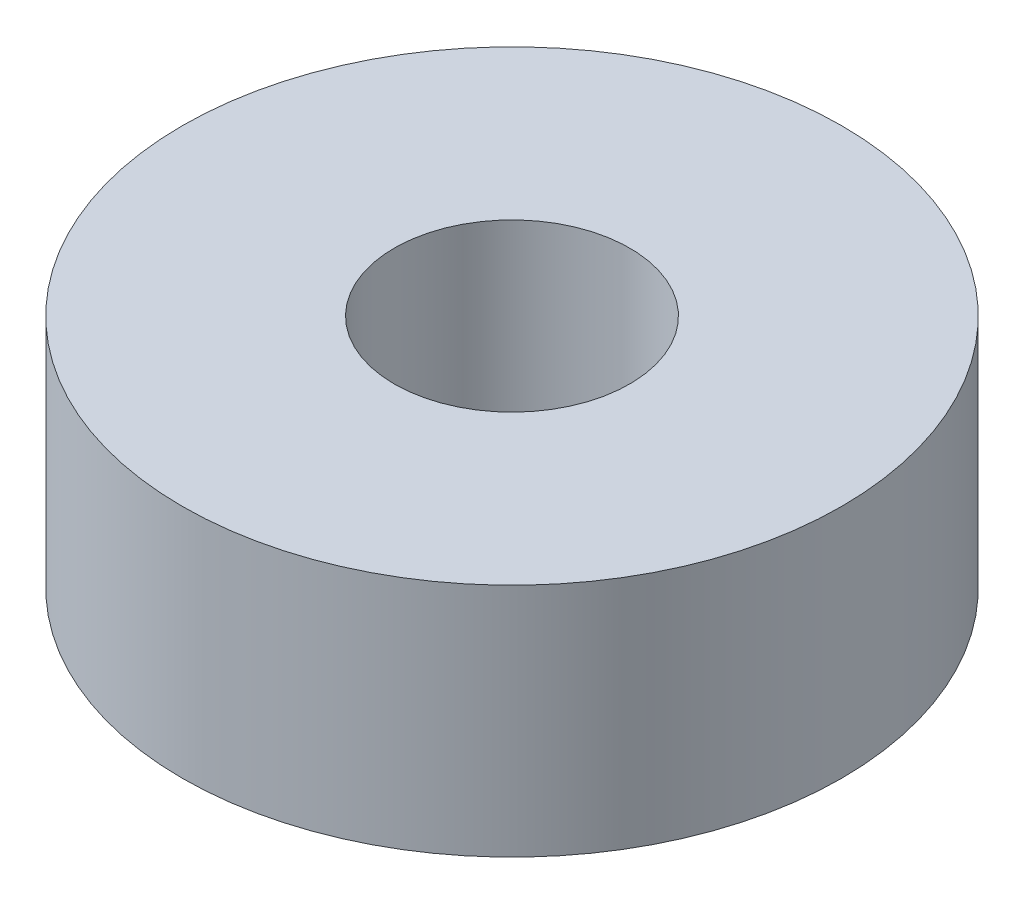
ISO-10303-21;
HEADER;
FILE_DESCRIPTION(('STEP AP214'),'2;1');
FILE_NAME('part.step','',(''),(''),'','','');
FILE_SCHEMA(('AUTOMOTIVE_DESIGN { 1 0 10303 214 1 1 1 1 }'));
ENDSEC;
DATA;
#1=APPLICATION_CONTEXT('core data for automotive mechanical design processes');
#2=APPLICATION_PROTOCOL_DEFINITION('international standard','automotive_design',2000,#1);
#3=PRODUCT_CONTEXT('',#1,'mechanical');
#4=PRODUCT('Part','Part','',(#3));
#5=PRODUCT_RELATED_PRODUCT_CATEGORY('part','',(#4));
#6=PRODUCT_DEFINITION_FORMATION('','',#4);
#7=PRODUCT_DEFINITION_CONTEXT('part definition',#1,'design');
#8=PRODUCT_DEFINITION('design','',#6,#7);
#9=PRODUCT_DEFINITION_SHAPE('','',#8);
#10=(LENGTH_UNIT() NAMED_UNIT(*) SI_UNIT(.MILLI.,.METRE.));
#11=(NAMED_UNIT(*) PLANE_ANGLE_UNIT() SI_UNIT($,.RADIAN.));
#12=(NAMED_UNIT(*) SI_UNIT($,.STERADIAN.) SOLID_ANGLE_UNIT());
#13=UNCERTAINTY_MEASURE_WITH_UNIT(LENGTH_MEASURE(1.E-05),#10,'distance_accuracy_value','');
#14=(GEOMETRIC_REPRESENTATION_CONTEXT(3) GLOBAL_UNCERTAINTY_ASSIGNED_CONTEXT((#13)) GLOBAL_UNIT_ASSIGNED_CONTEXT((#10,
#11,#12)) REPRESENTATION_CONTEXT('',''));
#15=CARTESIAN_POINT('',(0.,0.,0.));
#16=DIRECTION('',(0.,0.,1.));
#17=DIRECTION('',(1.,0.,0.));
#18=AXIS2_PLACEMENT_3D('',#15,#16,#17);
#19=CARTESIAN_POINT('',(0.,2.5,0.));
#20=DIRECTION('',(0.,1.,0.));
#21=DIRECTION('',(0.,0.,1.));
#22=AXIS2_PLACEMENT_3D('',#19,#20,#21);
#23=PLANE('',#22);
#24=CARTESIAN_POINT('',(0.,2.5,0.));
#25=DIRECTION('',(0.,1.,0.));
#26=DIRECTION('',(0.,0.,1.));
#27=AXIS2_PLACEMENT_3D('',#24,#25,#26);
#28=CIRCLE('',#27,7.);
#29=CARTESIAN_POINT('',(0.,2.5,7.));
#30=VERTEX_POINT('',#29);
#31=EDGE_CURVE('E10',#30,#30,#28,.T.);
#32=ORIENTED_EDGE('',*,*,#31,.T.);
#33=EDGE_LOOP('',(#32));
#34=FACE_BOUND('',#33,.T.);
#35=CARTESIAN_POINT('',(0.,2.5,0.));
#36=DIRECTION('',(0.,1.,0.));
#37=DIRECTION('',(0.,0.,1.));
#38=AXIS2_PLACEMENT_3D('',#35,#36,#37);
#39=CIRCLE('',#38,2.5);
#40=CARTESIAN_POINT('',(0.,2.5,2.5));
#41=VERTEX_POINT('',#40);
#42=EDGE_CURVE('E50',#41,#41,#39,.T.);
#43=ORIENTED_EDGE('',*,*,#42,.F.);
#44=EDGE_LOOP('',(#43));
#45=FACE_BOUND('',#44,.T.);
#46=ADVANCED_FACE('F37',(#34,#45),#23,.T.);
#47=CARTESIAN_POINT('',(0.,-2.5,0.));
#48=DIRECTION('',(0.,1.,0.));
#49=DIRECTION('',(0.,0.,1.));
#50=AXIS2_PLACEMENT_3D('',#47,#48,#49);
#51=PLANE('',#50);
#52=CARTESIAN_POINT('',(0.,-2.5,0.));
#53=DIRECTION('',(0.,1.,0.));
#54=DIRECTION('',(0.,0.,1.));
#55=AXIS2_PLACEMENT_3D('',#52,#53,#54);
#56=CIRCLE('',#55,7.);
#57=CARTESIAN_POINT('',(0.,-2.5,7.));
#58=VERTEX_POINT('',#57);
#59=EDGE_CURVE('E41',#58,#58,#56,.T.);
#60=ORIENTED_EDGE('',*,*,#59,.F.);
#61=EDGE_LOOP('',(#60));
#62=FACE_BOUND('',#61,.T.);
#63=CARTESIAN_POINT('',(0.,-2.5,0.));
#64=DIRECTION('',(0.,1.,0.));
#65=DIRECTION('',(0.,0.,1.));
#66=AXIS2_PLACEMENT_3D('',#63,#64,#65);
#67=CIRCLE('',#66,2.5);
#68=CARTESIAN_POINT('',(0.,-2.5,2.5));
#69=VERTEX_POINT('',#68);
#70=EDGE_CURVE('E52',#69,#69,#67,.T.);
#71=ORIENTED_EDGE('',*,*,#70,.T.);
#72=EDGE_LOOP('',(#71));
#73=FACE_BOUND('',#72,.T.);
#74=ADVANCED_FACE('F64',(#62,#73),#51,.F.);
#75=CARTESIAN_POINT('',(0.,2.5,0.));
#76=DIRECTION('',(0.,-1.,0.));
#77=DIRECTION('',(0.,0.,-1.));
#78=AXIS2_PLACEMENT_3D('',#75,#76,#77);
#79=CYLINDRICAL_SURFACE('',#78,7.);
#80=ORIENTED_EDGE('',*,*,#31,.F.);
#81=EDGE_LOOP('',(#80));
#82=FACE_BOUND('',#81,.T.);
#83=ORIENTED_EDGE('',*,*,#59,.T.);
#84=EDGE_LOOP('',(#83));
#85=FACE_BOUND('',#84,.T.);
#86=ADVANCED_FACE('F39',(#82,#85),#79,.T.);
#87=CARTESIAN_POINT('',(0.,2.5,0.));
#88=DIRECTION('',(0.,-1.,0.));
#89=DIRECTION('',(0.,0.,-1.));
#90=AXIS2_PLACEMENT_3D('',#87,#88,#89);
#91=CYLINDRICAL_SURFACE('',#90,2.5);
#92=ORIENTED_EDGE('',*,*,#42,.T.);
#93=EDGE_LOOP('',(#92));
#94=FACE_BOUND('',#93,.T.);
#95=ORIENTED_EDGE('',*,*,#70,.F.);
#96=EDGE_LOOP('',(#95));
#97=FACE_BOUND('',#96,.T.);
#98=ADVANCED_FACE('F60',(#94,#97),#91,.F.);
#99=CLOSED_SHELL('',(#46,#74,#86,#98));
#100=MANIFOLD_SOLID_BREP('B2',#99);
#101=ADVANCED_BREP_SHAPE_REPRESENTATION('',(#18,#100),#14);
#102=SHAPE_DEFINITION_REPRESENTATION(#9,#101);
ENDSEC;
END-ISO-10303-21;
